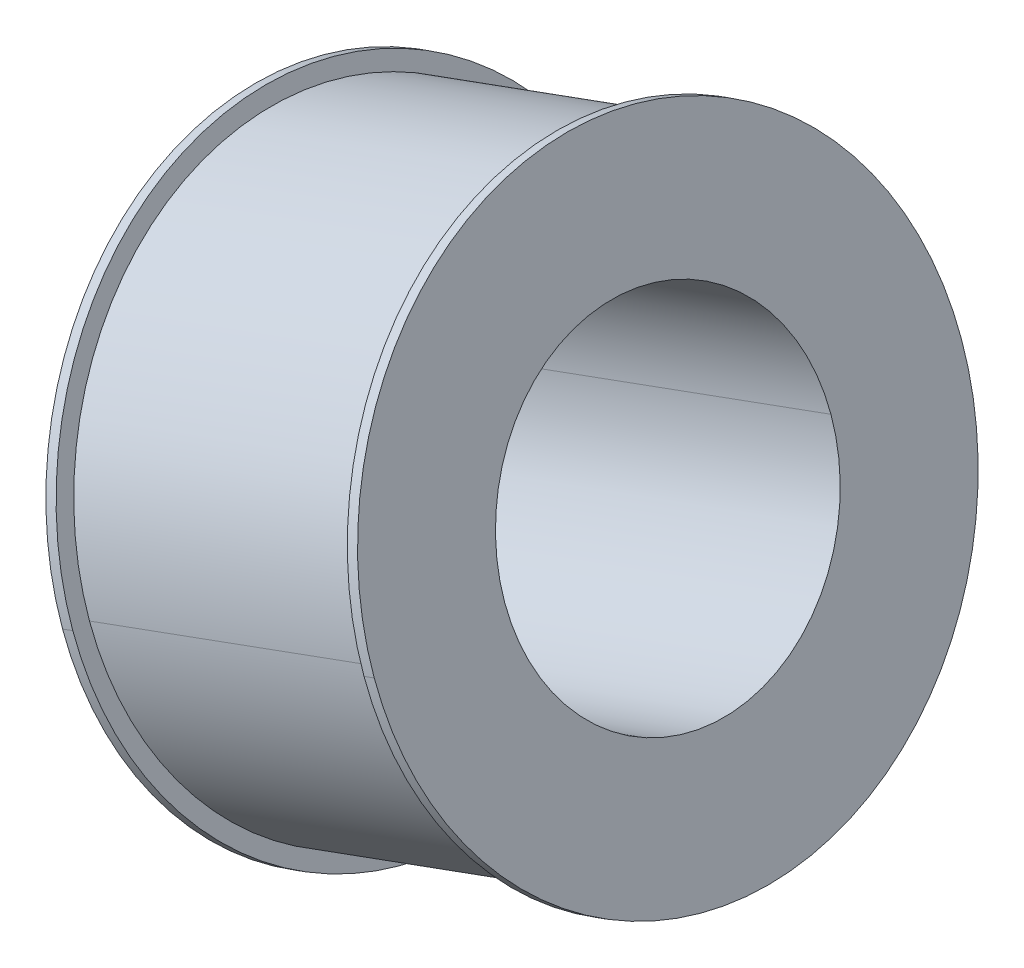
ISO-10303-21;
HEADER;
FILE_DESCRIPTION(('STEP AP214'),'2;1');
FILE_NAME('part.step','',(''),(''),'','','');
FILE_SCHEMA(('AUTOMOTIVE_DESIGN { 1 0 10303 214 1 1 1 1 }'));
ENDSEC;
DATA;
#1=APPLICATION_CONTEXT('core data for automotive mechanical design processes');
#2=APPLICATION_PROTOCOL_DEFINITION('international standard','automotive_design',2000,#1);
#3=PRODUCT_CONTEXT('',#1,'mechanical');
#4=PRODUCT('Part','Part','',(#3));
#5=PRODUCT_RELATED_PRODUCT_CATEGORY('part','',(#4));
#6=PRODUCT_DEFINITION_FORMATION('','',#4);
#7=PRODUCT_DEFINITION_CONTEXT('part definition',#1,'design');
#8=PRODUCT_DEFINITION('design','',#6,#7);
#9=PRODUCT_DEFINITION_SHAPE('','',#8);
#10=(LENGTH_UNIT() NAMED_UNIT(*) SI_UNIT(.MILLI.,.METRE.));
#11=(NAMED_UNIT(*) PLANE_ANGLE_UNIT() SI_UNIT($,.RADIAN.));
#12=(NAMED_UNIT(*) SI_UNIT($,.STERADIAN.) SOLID_ANGLE_UNIT());
#13=UNCERTAINTY_MEASURE_WITH_UNIT(LENGTH_MEASURE(1.E-05),#10,'distance_accuracy_value','');
#14=(GEOMETRIC_REPRESENTATION_CONTEXT(3) GLOBAL_UNCERTAINTY_ASSIGNED_CONTEXT((#13)) GLOBAL_UNIT_ASSIGNED_CONTEXT((#10,
#11,#12)) REPRESENTATION_CONTEXT('',''));
#15=CARTESIAN_POINT('',(0.,0.,0.));
#16=DIRECTION('',(0.,0.,1.));
#17=DIRECTION('',(1.,0.,0.));
#18=AXIS2_PLACEMENT_3D('',#15,#16,#17);
#19=CARTESIAN_POINT('',(53.8252917617742,-3.46148737991286,406.59864258433));
#20=DIRECTION('',(-0.93969262078591,-0.342020143325663,0.));
#21=DIRECTION('',(0.,0.,-1.));
#22=AXIS2_PLACEMENT_3D('',#19,#20,#21);
#23=CYLINDRICAL_SURFACE('',#22,27.);
#24=CARTESIAN_POINT('',(53.8252917617742,-3.46148737991286,406.59864258433));
#25=DIRECTION('',(-0.93969262078591,-0.342020143325663,0.));
#26=DIRECTION('',(0.,0.,-1.));
#27=AXIS2_PLACEMENT_3D('',#24,#25,#26);
#28=CIRCLE('',#27,27.);
#29=CARTESIAN_POINT('',(53.8252917617742,-3.46148737991286,379.59864258433));
#30=VERTEX_POINT('',#29);
#31=CARTESIAN_POINT('',(53.8252917617742,-3.46148737991287,433.59864258433));
#32=VERTEX_POINT('',#31);
#33=EDGE_CURVE('E11',#30,#32,#28,.T.);
#34=ORIENTED_EDGE('',*,*,#33,.T.);
#35=DIRECTION('',(-0.93969262078591,-0.342020143325663,0.));
#36=VECTOR('',#35,1.);
#37=CARTESIAN_POINT('',(53.8252917617742,-3.46148737991287,433.59864258433));
#38=LINE('',#37,#36);
#39=CARTESIAN_POINT('',(52.8855991409883,-3.80350752323853,433.59864258433));
#40=VERTEX_POINT('',#39);
#41=EDGE_CURVE('E55',#32,#40,#38,.T.);
#42=ORIENTED_EDGE('',*,*,#41,.T.);
#43=CARTESIAN_POINT('',(52.8855991409883,-3.80350752323853,406.59864258433));
#44=DIRECTION('',(-0.93969262078591,-0.342020143325663,0.));
#45=DIRECTION('',(0.,0.,-1.));
#46=AXIS2_PLACEMENT_3D('',#43,#44,#45);
#47=CIRCLE('',#46,27.);
#48=CARTESIAN_POINT('',(52.8855991409883,-3.80350752323853,379.59864258433));
#49=VERTEX_POINT('',#48);
#50=EDGE_CURVE('E180',#49,#40,#47,.T.);
#51=ORIENTED_EDGE('',*,*,#50,.F.);
#52=DIRECTION('',(-0.93969262078591,-0.342020143325663,0.));
#53=VECTOR('',#52,1.);
#54=CARTESIAN_POINT('',(53.8252917617742,-3.46148737991286,379.59864258433));
#55=LINE('',#54,#53);
#56=EDGE_CURVE('E140',#30,#49,#55,.T.);
#57=ORIENTED_EDGE('',*,*,#56,.F.);
#58=EDGE_LOOP('',(#34,#42,#51,#57));
#59=FACE_BOUND('',#58,.T.);
#60=ADVANCED_FACE('F44',(#59),#23,.T.);
#61=CARTESIAN_POINT('',(80.6065314541727,6.28608670486854,406.59864258433));
#62=DIRECTION('',(0.93969262078591,0.342020143325663,0.));
#63=DIRECTION('',(0.,0.,1.));
#64=AXIS2_PLACEMENT_3D('',#61,#62,#63);
#65=CYLINDRICAL_SURFACE('',#64,27.);
#66=CARTESIAN_POINT('',(80.6065314541727,6.28608670486854,406.59864258433));
#67=DIRECTION('',(0.93969262078591,0.342020143325663,0.));
#68=DIRECTION('',(0.,0.,1.));
#69=AXIS2_PLACEMENT_3D('',#66,#67,#68);
#70=CIRCLE('',#69,27.);
#71=CARTESIAN_POINT('',(80.6065314541727,6.28608670486854,433.59864258433));
#72=VERTEX_POINT('',#71);
#73=CARTESIAN_POINT('',(80.6065314541727,6.28608670486853,379.59864258433));
#74=VERTEX_POINT('',#73);
#75=EDGE_CURVE('E172',#72,#74,#70,.T.);
#76=ORIENTED_EDGE('',*,*,#75,.T.);
#77=DIRECTION('',(0.93969262078591,0.342020143325663,0.));
#78=VECTOR('',#77,1.);
#79=CARTESIAN_POINT('',(80.6065314541727,6.28608670486853,379.59864258433));
#80=LINE('',#79,#78);
#81=CARTESIAN_POINT('',(81.5462240749586,6.6281068481942,379.59864258433));
#82=VERTEX_POINT('',#81);
#83=EDGE_CURVE('E168',#74,#82,#80,.T.);
#84=ORIENTED_EDGE('',*,*,#83,.T.);
#85=CARTESIAN_POINT('',(81.5462240749586,6.6281068481942,406.59864258433));
#86=DIRECTION('',(0.93969262078591,0.342020143325663,0.));
#87=DIRECTION('',(0.,0.,1.));
#88=AXIS2_PLACEMENT_3D('',#85,#86,#87);
#89=CIRCLE('',#88,27.);
#90=CARTESIAN_POINT('',(81.5462240749586,6.6281068481942,433.59864258433));
#91=VERTEX_POINT('',#90);
#92=EDGE_CURVE('E179',#91,#82,#89,.T.);
#93=ORIENTED_EDGE('',*,*,#92,.F.);
#94=DIRECTION('',(0.93969262078591,0.342020143325663,0.));
#95=VECTOR('',#94,1.);
#96=CARTESIAN_POINT('',(80.6065314541727,6.28608670486854,433.59864258433));
#97=LINE('',#96,#95);
#98=EDGE_CURVE('E220',#72,#91,#97,.T.);
#99=ORIENTED_EDGE('',*,*,#98,.F.);
#100=EDGE_LOOP('',(#76,#84,#93,#99));
#101=FACE_BOUND('',#100,.T.);
#102=ADVANCED_FACE('F242',(#101),#65,.T.);
#103=CARTESIAN_POINT('',(52.8855991409883,-3.80350752323853,406.59864258433));
#104=DIRECTION('',(-0.93969262078591,-0.342020143325663,0.));
#105=DIRECTION('',(0.,0.,-1.));
#106=AXIS2_PLACEMENT_3D('',#103,#104,#105);
#107=CYLINDRICAL_SURFACE('',#106,15.);
#108=CARTESIAN_POINT('',(81.5462240749586,6.6281068481942,406.59864258433));
#109=DIRECTION('',(0.93969262078591,0.342020143325663,0.));
#110=DIRECTION('',(0.,0.,1.));
#111=AXIS2_PLACEMENT_3D('',#108,#109,#110);
#112=CIRCLE('',#111,15.);
#113=CARTESIAN_POINT('',(81.5462240749586,6.6281068481942,391.59864258433));
#114=VERTEX_POINT('',#113);
#115=CARTESIAN_POINT('',(81.5462240749586,6.6281068481942,421.59864258433));
#116=VERTEX_POINT('',#115);
#117=EDGE_CURVE('E173',#114,#116,#112,.T.);
#118=ORIENTED_EDGE('',*,*,#117,.T.);
#119=DIRECTION('',(-0.93969262078591,-0.342020143325663,0.));
#120=VECTOR('',#119,1.);
#121=CARTESIAN_POINT('',(52.8855991409883,-3.80350752323853,421.59864258433));
#122=LINE('',#121,#120);
#123=CARTESIAN_POINT('',(45.837904485094,-6.368658598181,421.59864258433));
#124=VERTEX_POINT('',#123);
#125=EDGE_CURVE('E211',#116,#124,#122,.T.);
#126=ORIENTED_EDGE('',*,*,#125,.T.);
#127=CARTESIAN_POINT('',(45.837904485094,-6.368658598181,406.59864258433));
#128=DIRECTION('',(0.93969262078591,0.342020143325663,0.));
#129=DIRECTION('',(0.,0.,1.));
#130=AXIS2_PLACEMENT_3D('',#127,#128,#129);
#131=CIRCLE('',#130,15.);
#132=CARTESIAN_POINT('',(45.837904485094,-6.368658598181,391.59864258433));
#133=VERTEX_POINT('',#132);
#134=EDGE_CURVE('E148',#133,#124,#131,.T.);
#135=ORIENTED_EDGE('',*,*,#134,.F.);
#136=DIRECTION('',(-0.93969262078591,-0.342020143325663,0.));
#137=VECTOR('',#136,1.);
#138=CARTESIAN_POINT('',(52.8855991409883,-3.80350752323853,391.59864258433));
#139=LINE('',#138,#137);
#140=EDGE_CURVE('E185',#114,#133,#139,.T.);
#141=ORIENTED_EDGE('',*,*,#140,.F.);
#142=EDGE_LOOP('',(#118,#126,#135,#141));
#143=FACE_BOUND('',#142,.T.);
#144=ADVANCED_FACE('F259',(#143),#107,.F.);
#145=CARTESIAN_POINT('',(52.8855991409883,-3.80350752323853,406.59864258433));
#146=DIRECTION('',(-0.93969262078591,-0.342020143325663,0.));
#147=DIRECTION('',(0.,0.,-1.));
#148=AXIS2_PLACEMENT_3D('',#145,#146,#147);
#149=CYLINDRICAL_SURFACE('',#148,19.);
#150=CARTESIAN_POINT('',(52.8855991409883,-3.80350752323853,406.59864258433));
#151=DIRECTION('',(0.93969262078591,0.342020143325663,0.));
#152=DIRECTION('',(0.,0.,1.));
#153=AXIS2_PLACEMENT_3D('',#150,#151,#152);
#154=CIRCLE('',#153,19.);
#155=CARTESIAN_POINT('',(52.8855991409883,-3.80350752323853,425.59864258433));
#156=VERTEX_POINT('',#155);
#157=CARTESIAN_POINT('',(52.8855991409883,-3.80350752323853,387.59864258433));
#158=VERTEX_POINT('',#157);
#159=EDGE_CURVE('E225',#156,#158,#154,.T.);
#160=ORIENTED_EDGE('',*,*,#159,.F.);
#161=DIRECTION('',(-0.93969262078591,-0.342020143325663,0.));
#162=VECTOR('',#161,1.);
#163=CARTESIAN_POINT('',(52.8855991409883,-3.80350752323853,425.59864258433));
#164=LINE('',#163,#162);
#165=CARTESIAN_POINT('',(45.837904485094,-6.368658598181,425.59864258433));
#166=VERTEX_POINT('',#165);
#167=EDGE_CURVE('E214',#156,#166,#164,.T.);
#168=ORIENTED_EDGE('',*,*,#167,.T.);
#169=CARTESIAN_POINT('',(45.837904485094,-6.368658598181,406.59864258433));
#170=DIRECTION('',(0.93969262078591,0.342020143325663,0.));
#171=DIRECTION('',(0.,0.,1.));
#172=AXIS2_PLACEMENT_3D('',#169,#170,#171);
#173=CIRCLE('',#172,19.);
#174=CARTESIAN_POINT('',(45.837904485094,-6.368658598181,387.59864258433));
#175=VERTEX_POINT('',#174);
#176=EDGE_CURVE('E313',#166,#175,#173,.T.);
#177=ORIENTED_EDGE('',*,*,#176,.T.);
#178=DIRECTION('',(-0.93969262078591,-0.342020143325663,0.));
#179=VECTOR('',#178,1.);
#180=CARTESIAN_POINT('',(52.8855991409883,-3.80350752323853,387.59864258433));
#181=LINE('',#180,#179);
#182=EDGE_CURVE('E164',#158,#175,#181,.T.);
#183=ORIENTED_EDGE('',*,*,#182,.F.);
#184=EDGE_LOOP('',(#160,#168,#177,#183));
#185=FACE_BOUND('',#184,.T.);
#186=ADVANCED_FACE('F299',(#185),#149,.T.);
#187=CARTESIAN_POINT('',(81.5462240749586,6.6281068481942,406.59864258433));
#188=DIRECTION('',(-0.93969262078591,-0.342020143325663,0.));
#189=DIRECTION('',(0.,0.,-1.));
#190=AXIS2_PLACEMENT_3D('',#187,#188,#189);
#191=CYLINDRICAL_SURFACE('',#190,25.465);
#192=CARTESIAN_POINT('',(80.6065314541727,6.28608670486854,406.59864258433));
#193=DIRECTION('',(0.93969262078591,0.342020143325663,0.));
#194=DIRECTION('',(0.,0.,1.));
#195=AXIS2_PLACEMENT_3D('',#192,#193,#194);
#196=CIRCLE('',#195,25.465);
#197=CARTESIAN_POINT('',(80.6065314541727,6.28608670486853,432.06364258433));
#198=VERTEX_POINT('',#197);
#199=CARTESIAN_POINT('',(80.6065314541727,6.28608670486854,381.13364258433));
#200=VERTEX_POINT('',#199);
#201=EDGE_CURVE('E157',#198,#200,#196,.T.);
#202=ORIENTED_EDGE('',*,*,#201,.F.);
#203=DIRECTION('',(-0.93969262078591,-0.342020143325663,0.));
#204=VECTOR('',#203,1.);
#205=CARTESIAN_POINT('',(81.5462240749586,6.6281068481942,432.06364258433));
#206=LINE('',#205,#204);
#207=CARTESIAN_POINT('',(53.8252917617742,-3.46148737991287,432.06364258433));
#208=VERTEX_POINT('',#207);
#209=EDGE_CURVE('E135',#198,#208,#206,.T.);
#210=ORIENTED_EDGE('',*,*,#209,.T.);
#211=CARTESIAN_POINT('',(53.8252917617742,-3.46148737991286,406.59864258433));
#212=DIRECTION('',(-0.93969262078591,-0.342020143325663,0.));
#213=DIRECTION('',(0.,0.,-1.));
#214=AXIS2_PLACEMENT_3D('',#211,#212,#213);
#215=CIRCLE('',#214,25.465);
#216=CARTESIAN_POINT('',(53.8252917617742,-3.46148737991286,381.13364258433));
#217=VERTEX_POINT('',#216);
#218=EDGE_CURVE('E128',#217,#208,#215,.T.);
#219=ORIENTED_EDGE('',*,*,#218,.F.);
#220=DIRECTION('',(-0.93969262078591,-0.342020143325663,0.));
#221=VECTOR('',#220,1.);
#222=CARTESIAN_POINT('',(81.5462240749586,6.6281068481942,381.13364258433));
#223=LINE('',#222,#221);
#224=EDGE_CURVE('E132',#200,#217,#223,.T.);
#225=ORIENTED_EDGE('',*,*,#224,.F.);
#226=EDGE_LOOP('',(#202,#210,#219,#225));
#227=FACE_BOUND('',#226,.T.);
#228=ADVANCED_FACE('F131',(#227),#191,.T.);
#229=CARTESIAN_POINT('',(81.5462240749586,6.6281068481942,406.59864258433));
#230=DIRECTION('',(-0.93969262078591,-0.342020143325663,0.));
#231=DIRECTION('',(0.,0.,-1.));
#232=AXIS2_PLACEMENT_3D('',#229,#230,#231);
#233=CYLINDRICAL_SURFACE('',#232,25.465);
#234=ORIENTED_EDGE('',*,*,#209,.F.);
#235=CARTESIAN_POINT('',(80.6065314541727,6.28608670486854,406.59864258433));
#236=DIRECTION('',(0.93969262078591,0.342020143325663,0.));
#237=DIRECTION('',(0.,0.,1.));
#238=AXIS2_PLACEMENT_3D('',#235,#236,#237);
#239=CIRCLE('',#238,25.465);
#240=EDGE_CURVE('E146',#200,#198,#239,.T.);
#241=ORIENTED_EDGE('',*,*,#240,.F.);
#242=ORIENTED_EDGE('',*,*,#224,.T.);
#243=CARTESIAN_POINT('',(53.8252917617742,-3.46148737991286,406.59864258433));
#244=DIRECTION('',(-0.93969262078591,-0.342020143325663,0.));
#245=DIRECTION('',(0.,0.,-1.));
#246=AXIS2_PLACEMENT_3D('',#243,#244,#245);
#247=CIRCLE('',#246,25.465);
#248=EDGE_CURVE('E141',#208,#217,#247,.T.);
#249=ORIENTED_EDGE('',*,*,#248,.F.);
#250=EDGE_LOOP('',(#234,#241,#242,#249));
#251=FACE_BOUND('',#250,.T.);
#252=ADVANCED_FACE('F144',(#251),#233,.T.);
#253=CARTESIAN_POINT('',(45.837904485094,-6.368658598181,406.59864258433));
#254=DIRECTION('',(0.93969262078591,0.342020143325663,0.));
#255=DIRECTION('',(0.342020143325663,-0.93969262078591,0.));
#256=AXIS2_PLACEMENT_3D('',#253,#254,#255);
#257=PLANE('',#256);
#258=CARTESIAN_POINT('',(45.837904485094,-6.368658598181,406.59864258433));
#259=DIRECTION('',(0.93969262078591,0.342020143325663,0.));
#260=DIRECTION('',(0.,0.,1.));
#261=AXIS2_PLACEMENT_3D('',#258,#259,#260);
#262=CIRCLE('',#261,19.);
#263=EDGE_CURVE('E160',#175,#166,#262,.T.);
#264=ORIENTED_EDGE('',*,*,#263,.F.);
#265=ORIENTED_EDGE('',*,*,#176,.F.);
#266=EDGE_LOOP('',(#264,#265));
#267=FACE_BOUND('',#266,.T.);
#268=ORIENTED_EDGE('',*,*,#134,.T.);
#269=CARTESIAN_POINT('',(45.837904485094,-6.368658598181,406.59864258433));
#270=DIRECTION('',(0.93969262078591,0.342020143325663,0.));
#271=DIRECTION('',(0.,0.,1.));
#272=AXIS2_PLACEMENT_3D('',#269,#270,#271);
#273=CIRCLE('',#272,15.);
#274=EDGE_CURVE('E188',#124,#133,#273,.T.);
#275=ORIENTED_EDGE('',*,*,#274,.T.);
#276=EDGE_LOOP('',(#268,#275));
#277=FACE_BOUND('',#276,.T.);
#278=ADVANCED_FACE('F260',(#267,#277),#257,.F.);
#279=CARTESIAN_POINT('',(52.8855991409883,-3.80350752323853,406.59864258433));
#280=DIRECTION('',(-0.93969262078591,-0.342020143325663,0.));
#281=DIRECTION('',(0.,0.,-1.));
#282=AXIS2_PLACEMENT_3D('',#279,#280,#281);
#283=CYLINDRICAL_SURFACE('',#282,19.);
#284=ORIENTED_EDGE('',*,*,#167,.F.);
#285=CARTESIAN_POINT('',(52.8855991409883,-3.80350752323853,406.59864258433));
#286=DIRECTION('',(0.93969262078591,0.342020143325663,0.));
#287=DIRECTION('',(0.,0.,1.));
#288=AXIS2_PLACEMENT_3D('',#285,#286,#287);
#289=CIRCLE('',#288,19.);
#290=EDGE_CURVE('E48',#158,#156,#289,.T.);
#291=ORIENTED_EDGE('',*,*,#290,.F.);
#292=ORIENTED_EDGE('',*,*,#182,.T.);
#293=ORIENTED_EDGE('',*,*,#263,.T.);
#294=EDGE_LOOP('',(#284,#291,#292,#293));
#295=FACE_BOUND('',#294,.T.);
#296=ADVANCED_FACE('F262',(#295),#283,.T.);
#297=CARTESIAN_POINT('',(52.8855991409883,-3.80350752323853,406.59864258433));
#298=DIRECTION('',(-0.93969262078591,-0.342020143325663,0.));
#299=DIRECTION('',(0.,0.,-1.));
#300=AXIS2_PLACEMENT_3D('',#297,#298,#299);
#301=CYLINDRICAL_SURFACE('',#300,15.);
#302=ORIENTED_EDGE('',*,*,#125,.F.);
#303=CARTESIAN_POINT('',(81.5462240749586,6.6281068481942,406.59864258433));
#304=DIRECTION('',(0.93969262078591,0.342020143325663,0.));
#305=DIRECTION('',(0.,0.,1.));
#306=AXIS2_PLACEMENT_3D('',#303,#304,#305);
#307=CIRCLE('',#306,15.);
#308=EDGE_CURVE('E165',#116,#114,#307,.T.);
#309=ORIENTED_EDGE('',*,*,#308,.T.);
#310=ORIENTED_EDGE('',*,*,#140,.T.);
#311=ORIENTED_EDGE('',*,*,#274,.F.);
#312=EDGE_LOOP('',(#302,#309,#310,#311));
#313=FACE_BOUND('',#312,.T.);
#314=ADVANCED_FACE('F248',(#313),#301,.F.);
#315=CARTESIAN_POINT('',(81.5462240749586,6.6281068481942,406.59864258433));
#316=DIRECTION('',(0.93969262078591,0.342020143325663,0.));
#317=DIRECTION('',(0.342020143325663,-0.93969262078591,0.));
#318=AXIS2_PLACEMENT_3D('',#315,#316,#317);
#319=PLANE('',#318);
#320=ORIENTED_EDGE('',*,*,#92,.T.);
#321=CARTESIAN_POINT('',(81.5462240749586,6.6281068481942,406.59864258433));
#322=DIRECTION('',(0.93969262078591,0.342020143325663,0.));
#323=DIRECTION('',(0.,0.,1.));
#324=AXIS2_PLACEMENT_3D('',#321,#322,#323);
#325=CIRCLE('',#324,27.);
#326=EDGE_CURVE('E176',#82,#91,#325,.T.);
#327=ORIENTED_EDGE('',*,*,#326,.T.);
#328=EDGE_LOOP('',(#320,#327));
#329=FACE_BOUND('',#328,.T.);
#330=ORIENTED_EDGE('',*,*,#117,.F.);
#331=ORIENTED_EDGE('',*,*,#308,.F.);
#332=EDGE_LOOP('',(#330,#331));
#333=FACE_BOUND('',#332,.T.);
#334=ADVANCED_FACE('F244',(#329,#333),#319,.T.);
#335=CARTESIAN_POINT('',(52.8855991409883,-3.80350752323853,406.59864258433));
#336=DIRECTION('',(0.93969262078591,0.342020143325663,0.));
#337=DIRECTION('',(0.342020143325663,-0.93969262078591,0.));
#338=AXIS2_PLACEMENT_3D('',#335,#336,#337);
#339=PLANE('',#338);
#340=ORIENTED_EDGE('',*,*,#50,.T.);
#341=CARTESIAN_POINT('',(52.8855991409883,-3.80350752323853,406.59864258433));
#342=DIRECTION('',(-0.93969262078591,-0.342020143325663,0.));
#343=DIRECTION('',(0.,0.,-1.));
#344=AXIS2_PLACEMENT_3D('',#341,#342,#343);
#345=CIRCLE('',#344,27.);
#346=EDGE_CURVE('E187',#40,#49,#345,.T.);
#347=ORIENTED_EDGE('',*,*,#346,.T.);
#348=EDGE_LOOP('',(#340,#347));
#349=FACE_BOUND('',#348,.T.);
#350=ORIENTED_EDGE('',*,*,#290,.T.);
#351=ORIENTED_EDGE('',*,*,#159,.T.);
#352=EDGE_LOOP('',(#350,#351));
#353=FACE_BOUND('',#352,.T.);
#354=ADVANCED_FACE('F247',(#349,#353),#339,.F.);
#355=CARTESIAN_POINT('',(80.6065314541727,6.28608670486854,406.59864258433));
#356=DIRECTION('',(0.93969262078591,0.342020143325663,0.));
#357=DIRECTION('',(0.,0.,1.));
#358=AXIS2_PLACEMENT_3D('',#355,#356,#357);
#359=CYLINDRICAL_SURFACE('',#358,27.);
#360=ORIENTED_EDGE('',*,*,#83,.F.);
#361=CARTESIAN_POINT('',(80.6065314541727,6.28608670486854,406.59864258433));
#362=DIRECTION('',(0.93969262078591,0.342020143325663,0.));
#363=DIRECTION('',(0.,0.,1.));
#364=AXIS2_PLACEMENT_3D('',#361,#362,#363);
#365=CIRCLE('',#364,27.);
#366=EDGE_CURVE('E221',#74,#72,#365,.T.);
#367=ORIENTED_EDGE('',*,*,#366,.T.);
#368=ORIENTED_EDGE('',*,*,#98,.T.);
#369=ORIENTED_EDGE('',*,*,#326,.F.);
#370=EDGE_LOOP('',(#360,#367,#368,#369));
#371=FACE_BOUND('',#370,.T.);
#372=ADVANCED_FACE('F237',(#371),#359,.T.);
#373=CARTESIAN_POINT('',(80.6065314541727,6.28608670486854,406.59864258433));
#374=DIRECTION('',(0.93969262078591,0.342020143325663,0.));
#375=DIRECTION('',(0.342020143325663,-0.93969262078591,0.));
#376=AXIS2_PLACEMENT_3D('',#373,#374,#375);
#377=PLANE('',#376);
#378=ORIENTED_EDGE('',*,*,#75,.F.);
#379=ORIENTED_EDGE('',*,*,#366,.F.);
#380=EDGE_LOOP('',(#378,#379));
#381=FACE_BOUND('',#380,.T.);
#382=ORIENTED_EDGE('',*,*,#240,.T.);
#383=ORIENTED_EDGE('',*,*,#201,.T.);
#384=EDGE_LOOP('',(#382,#383));
#385=FACE_BOUND('',#384,.T.);
#386=ADVANCED_FACE('F281',(#381,#385),#377,.F.);
#387=CARTESIAN_POINT('',(53.8252917617742,-3.46148737991286,406.59864258433));
#388=DIRECTION('',(-0.93969262078591,-0.342020143325663,0.));
#389=DIRECTION('',(0.,0.,-1.));
#390=AXIS2_PLACEMENT_3D('',#387,#388,#389);
#391=CYLINDRICAL_SURFACE('',#390,27.);
#392=ORIENTED_EDGE('',*,*,#41,.F.);
#393=CARTESIAN_POINT('',(53.8252917617742,-3.46148737991286,406.59864258433));
#394=DIRECTION('',(-0.93969262078591,-0.342020143325663,0.));
#395=DIRECTION('',(0.,0.,-1.));
#396=AXIS2_PLACEMENT_3D('',#393,#394,#395);
#397=CIRCLE('',#396,27.);
#398=EDGE_CURVE('E159',#32,#30,#397,.T.);
#399=ORIENTED_EDGE('',*,*,#398,.T.);
#400=ORIENTED_EDGE('',*,*,#56,.T.);
#401=ORIENTED_EDGE('',*,*,#346,.F.);
#402=EDGE_LOOP('',(#392,#399,#400,#401));
#403=FACE_BOUND('',#402,.T.);
#404=ADVANCED_FACE('F284',(#403),#391,.T.);
#405=CARTESIAN_POINT('',(53.8252917617742,-3.46148737991286,406.59864258433));
#406=DIRECTION('',(-0.93969262078591,-0.342020143325663,0.));
#407=DIRECTION('',(0.,0.,-1.));
#408=AXIS2_PLACEMENT_3D('',#405,#406,#407);
#409=PLANE('',#408);
#410=ORIENTED_EDGE('',*,*,#33,.F.);
#411=ORIENTED_EDGE('',*,*,#398,.F.);
#412=EDGE_LOOP('',(#410,#411));
#413=FACE_BOUND('',#412,.T.);
#414=ORIENTED_EDGE('',*,*,#218,.T.);
#415=ORIENTED_EDGE('',*,*,#248,.T.);
#416=EDGE_LOOP('',(#414,#415));
#417=FACE_BOUND('',#416,.T.);
#418=ADVANCED_FACE('F46',(#413,#417),#409,.F.);
#419=CLOSED_SHELL('',(#60,#102,#144,#186,#228,#252,#278,#296,#314,#334,#354,#372,#386,#404,#418));
#420=MANIFOLD_SOLID_BREP('B2',#419);
#421=ADVANCED_BREP_SHAPE_REPRESENTATION('',(#18,#420),#14);
#422=SHAPE_DEFINITION_REPRESENTATION(#9,#421);
ENDSEC;
END-ISO-10303-21;
